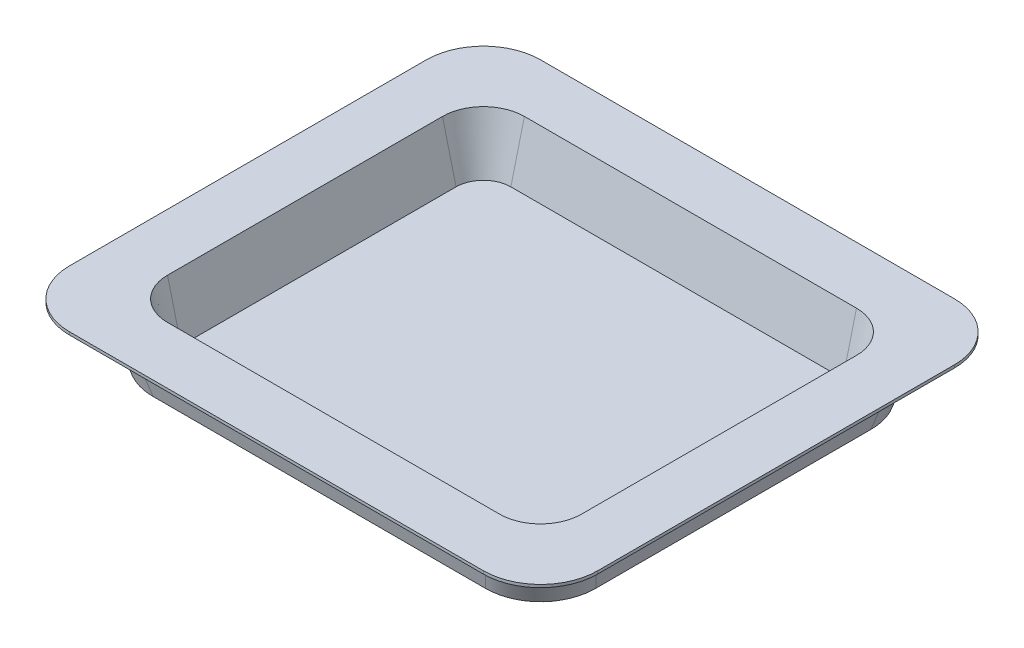
ISO-10303-21;
HEADER;
FILE_DESCRIPTION(('STEP AP214'),'2;1');
FILE_NAME('part.step','',(''),(''),'','','');
FILE_SCHEMA(('AUTOMOTIVE_DESIGN { 1 0 10303 214 1 1 1 1 }'));
ENDSEC;
DATA;
#1=APPLICATION_CONTEXT('core data for automotive mechanical design processes');
#2=APPLICATION_PROTOCOL_DEFINITION('international standard','automotive_design',2000,#1);
#3=PRODUCT_CONTEXT('',#1,'mechanical');
#4=PRODUCT('Part','Part','',(#3));
#5=PRODUCT_RELATED_PRODUCT_CATEGORY('part','',(#4));
#6=PRODUCT_DEFINITION_FORMATION('','',#4);
#7=PRODUCT_DEFINITION_CONTEXT('part definition',#1,'design');
#8=PRODUCT_DEFINITION('design','',#6,#7);
#9=PRODUCT_DEFINITION_SHAPE('','',#8);
#10=(LENGTH_UNIT() NAMED_UNIT(*) SI_UNIT(.MILLI.,.METRE.));
#11=(NAMED_UNIT(*) PLANE_ANGLE_UNIT() SI_UNIT($,.RADIAN.));
#12=(NAMED_UNIT(*) SI_UNIT($,.STERADIAN.) SOLID_ANGLE_UNIT());
#13=UNCERTAINTY_MEASURE_WITH_UNIT(LENGTH_MEASURE(1.E-05),#10,'distance_accuracy_value','');
#14=(GEOMETRIC_REPRESENTATION_CONTEXT(3) GLOBAL_UNCERTAINTY_ASSIGNED_CONTEXT((#13)) GLOBAL_UNIT_ASSIGNED_CONTEXT((#10,
#11,#12)) REPRESENTATION_CONTEXT('',''));
#15=CARTESIAN_POINT('',(0.,0.,0.));
#16=DIRECTION('',(0.,0.,1.));
#17=DIRECTION('',(1.,0.,0.));
#18=AXIS2_PLACEMENT_3D('',#15,#16,#17);
#19=CARTESIAN_POINT('',(326.248227946916,1.14491749414469E-12,0.));
#20=DIRECTION('',(0.,1.,0.));
#21=DIRECTION('',(0.,0.,-1.));
#22=AXIS2_PLACEMENT_3D('',#19,#20,#21);
#23=PLANE('',#22);
#24=CARTESIAN_POINT('',(-21.025886026542,-1.27675647831893E-12,-12.0952380952381));
#25=DIRECTION('',(0.,1.,0.));
#26=DIRECTION('',(0.,0.,-1.));
#27=AXIS2_PLACEMENT_3D('',#24,#25,#26);
#28=CIRCLE('',#27,50.8);
#29=CARTESIAN_POINT('',(-21.025886026542,-1.27675647831893E-12,38.7047619047619));
#30=VERTEX_POINT('',#29);
#31=CARTESIAN_POINT('',(-71.825886026542,-1.63757896132211E-12,-12.0952380952382));
#32=VERTEX_POINT('',#31);
#33=EDGE_CURVE('E63',#30,#32,#28,.F.);
#34=ORIENTED_EDGE('',*,*,#33,.F.);
#35=DIRECTION('',(-1.,0.,0.));
#36=VECTOR('',#35,1.);
#37=CARTESIAN_POINT('',(-71.825886026542,-1.63757896132211E-12,38.7047619047619));
#38=LINE('',#37,#36);
#39=CARTESIAN_POINT('',(347.274113973458,1.29063426612674E-12,38.7047619047619));
#40=VERTEX_POINT('',#39);
#41=EDGE_CURVE('E326',#40,#30,#38,.T.);
#42=ORIENTED_EDGE('',*,*,#41,.F.);
#43=CARTESIAN_POINT('',(347.274113973458,1.29063426612674E-12,-12.0952380952381));
#44=DIRECTION('',(0.,1.,0.));
#45=DIRECTION('',(0.,0.,-1.));
#46=AXIS2_PLACEMENT_3D('',#43,#44,#45);
#47=CIRCLE('',#46,50.8);
#48=CARTESIAN_POINT('',(398.074113973458,1.64451785522601E-12,-12.0952380952381));
#49=VERTEX_POINT('',#48);
#50=EDGE_CURVE('E289',#49,#40,#47,.F.);
#51=ORIENTED_EDGE('',*,*,#50,.F.);
#52=DIRECTION('',(0.,0.,1.));
#53=VECTOR('',#52,1.);
#54=CARTESIAN_POINT('',(398.074113973458,1.64451785522601E-12,-380.395238095238));
#55=LINE('',#54,#53);
#56=CARTESIAN_POINT('',(398.074113973458,1.64451785522601E-12,-329.595238095238));
#57=VERTEX_POINT('',#56);
#58=EDGE_CURVE('E324',#57,#49,#55,.T.);
#59=ORIENTED_EDGE('',*,*,#58,.F.);
#60=CARTESIAN_POINT('',(347.274113973458,1.29063426612674E-12,-329.595238095238));
#61=DIRECTION('',(0.,1.,0.));
#62=DIRECTION('',(0.,0.,-1.));
#63=AXIS2_PLACEMENT_3D('',#60,#61,#62);
#64=CIRCLE('',#63,50.8);
#65=CARTESIAN_POINT('',(347.274113973458,1.29063426612674E-12,-380.395238095238));
#66=VERTEX_POINT('',#65);
#67=EDGE_CURVE('E282',#66,#57,#64,.F.);
#68=ORIENTED_EDGE('',*,*,#67,.F.);
#69=DIRECTION('',(1.,0.,0.));
#70=VECTOR('',#69,1.);
#71=CARTESIAN_POINT('',(398.074113973458,1.64451785522601E-12,-380.395238095238));
#72=LINE('',#71,#70);
#73=CARTESIAN_POINT('',(-21.025886026542,-1.27675647831893E-12,-380.395238095238));
#74=VERTEX_POINT('',#73);
#75=EDGE_CURVE('E322',#74,#66,#72,.T.);
#76=ORIENTED_EDGE('',*,*,#75,.F.);
#77=CARTESIAN_POINT('',(-21.025886026542,-1.27675647831893E-12,-329.595238095238));
#78=DIRECTION('',(0.,1.,0.));
#79=DIRECTION('',(0.,0.,-1.));
#80=AXIS2_PLACEMENT_3D('',#77,#78,#79);
#81=CIRCLE('',#80,50.8);
#82=CARTESIAN_POINT('',(-71.825886026542,-1.63757896132211E-12,-329.595238095238));
#83=VERTEX_POINT('',#82);
#84=EDGE_CURVE('E276',#83,#74,#81,.F.);
#85=ORIENTED_EDGE('',*,*,#84,.F.);
#86=DIRECTION('',(0.,0.,-1.));
#87=VECTOR('',#86,1.);
#88=CARTESIAN_POINT('',(-71.825886026542,-1.63757896132211E-12,-380.395238095238));
#89=LINE('',#88,#87);
#90=EDGE_CURVE('E329',#32,#83,#89,.T.);
#91=ORIENTED_EDGE('',*,*,#90,.F.);
#92=EDGE_LOOP('',(#34,#42,#51,#59,#68,#76,#85,#91));
#93=FACE_BOUND('',#92,.T.);
#94=DIRECTION('',(0.,0.,1.));
#95=VECTOR('',#94,1.);
#96=CARTESIAN_POINT('',(347.274113973458,1.29063426612674E-12,-293.167851602296));
#97=LINE('',#96,#95);
#98=CARTESIAN_POINT('',(347.274113973458,1.29063426612674E-12,-293.167851602296));
#99=VERTEX_POINT('',#98);
#100=CARTESIAN_POINT('',(347.274113973458,1.29063426612674E-12,-48.5226245881807));
#101=VERTEX_POINT('',#100);
#102=EDGE_CURVE('E221',#99,#101,#97,.T.);
#103=ORIENTED_EDGE('',*,*,#102,.T.);
#104=CARTESIAN_POINT('',(310.846727480515,1.04083408558608E-12,-48.5226245881806));
#105=DIRECTION('',(0.,-1.,0.));
#106=DIRECTION('',(0.,0.,-1.));
#107=AXIS2_PLACEMENT_3D('',#104,#105,#106);
#108=CIRCLE('',#107,36.4273864929425);
#109=CARTESIAN_POINT('',(310.846727480515,1.04083408558608E-12,-12.0952380952382));
#110=VERTEX_POINT('',#109);
#111=EDGE_CURVE('E55',#101,#110,#108,.T.);
#112=ORIENTED_EDGE('',*,*,#111,.T.);
#113=DIRECTION('',(-1.,0.,0.));
#114=VECTOR('',#113,1.);
#115=CARTESIAN_POINT('',(15.4015004664004,-1.02695629777827E-12,-12.0952380952382));
#116=LINE('',#115,#114);
#117=CARTESIAN_POINT('',(15.4015004664004,-1.02695629777827E-12,-12.0952380952382));
#118=VERTEX_POINT('',#117);
#119=EDGE_CURVE('E202',#110,#118,#116,.T.);
#120=ORIENTED_EDGE('',*,*,#119,.T.);
#121=CARTESIAN_POINT('',(15.4015004664004,-1.02695629777827E-12,-48.5226245881807));
#122=DIRECTION('',(0.,-1.,0.));
#123=DIRECTION('',(0.,0.,1.));
#124=AXIS2_PLACEMENT_3D('',#121,#122,#123);
#125=CIRCLE('',#124,36.4273864929425);
#126=CARTESIAN_POINT('',(-21.0258860265421,-1.27675647831893E-12,-48.5226245881806));
#127=VERTEX_POINT('',#126);
#128=EDGE_CURVE('E210',#118,#127,#125,.T.);
#129=ORIENTED_EDGE('',*,*,#128,.T.);
#130=DIRECTION('',(0.,0.,-1.));
#131=VECTOR('',#130,1.);
#132=CARTESIAN_POINT('',(-21.0258860265421,-1.27675647831893E-12,-293.167851602296));
#133=LINE('',#132,#131);
#134=CARTESIAN_POINT('',(-21.0258860265421,-1.27675647831893E-12,-293.167851602296));
#135=VERTEX_POINT('',#134);
#136=EDGE_CURVE('E225',#127,#135,#133,.T.);
#137=ORIENTED_EDGE('',*,*,#136,.T.);
#138=CARTESIAN_POINT('',(15.4015004664004,-1.02695629777827E-12,-293.167851602296));
#139=DIRECTION('',(0.,-1.,0.));
#140=DIRECTION('',(0.,0.,-1.));
#141=AXIS2_PLACEMENT_3D('',#138,#139,#140);
#142=CIRCLE('',#141,36.4273864929425);
#143=CARTESIAN_POINT('',(15.4015004664004,-1.02695629777827E-12,-329.595238095238));
#144=VERTEX_POINT('',#143);
#145=EDGE_CURVE('E228',#135,#144,#142,.T.);
#146=ORIENTED_EDGE('',*,*,#145,.T.);
#147=DIRECTION('',(1.,0.,0.));
#148=VECTOR('',#147,1.);
#149=CARTESIAN_POINT('',(310.846727480515,1.04083408558608E-12,-329.595238095238));
#150=LINE('',#149,#148);
#151=CARTESIAN_POINT('',(310.846727480515,1.04083408558608E-12,-329.595238095238));
#152=VERTEX_POINT('',#151);
#153=EDGE_CURVE('E231',#144,#152,#150,.T.);
#154=ORIENTED_EDGE('',*,*,#153,.T.);
#155=CARTESIAN_POINT('',(310.846727480515,1.04083408558608E-12,-293.167851602296));
#156=DIRECTION('',(0.,-1.,0.));
#157=DIRECTION('',(0.,0.,1.));
#158=AXIS2_PLACEMENT_3D('',#155,#156,#157);
#159=CIRCLE('',#158,36.4273864929425);
#160=EDGE_CURVE('E234',#152,#99,#159,.T.);
#161=ORIENTED_EDGE('',*,*,#160,.T.);
#162=EDGE_LOOP('',(#103,#112,#120,#129,#137,#146,#154,#161));
#163=FACE_BOUND('',#162,.T.);
#164=ADVANCED_FACE('F40',(#93,#163),#23,.T.);
#165=CARTESIAN_POINT('',(326.248227946916,-2.53999999999886,0.));
#166=DIRECTION('',(0.,-1.,0.));
#167=DIRECTION('',(0.,0.,1.));
#168=AXIS2_PLACEMENT_3D('',#165,#166,#167);
#169=PLANE('',#168);
#170=DIRECTION('',(0.,0.,-1.));
#171=VECTOR('',#170,1.);
#172=CARTESIAN_POINT('',(372.674113973458,-2.53999999999853,-354.995238095238));
#173=LINE('',#172,#171);
#174=CARTESIAN_POINT('',(372.674113973458,-2.53999999999853,-35.8226245881806));
#175=VERTEX_POINT('',#174);
#176=CARTESIAN_POINT('',(372.674113973458,-2.53999999999853,-305.867851602296));
#177=VERTEX_POINT('',#176);
#178=EDGE_CURVE('E312',#175,#177,#173,.T.);
#179=ORIENTED_EDGE('',*,*,#178,.T.);
#180=CARTESIAN_POINT('',(320.144553900672,-2.53999999999888,-302.465678022452));
#181=DIRECTION('',(0.,-1.,0.));
#182=DIRECTION('',(0.707106781186548,0.,-0.707106781186547));
#183=AXIS2_PLACEMENT_3D('',#180,#181,#182);
#184=ELLIPSE('',#183,54.203960767465,50.8);
#185=CARTESIAN_POINT('',(323.546727480515,-2.53999999999888,-354.995238095238));
#186=VERTEX_POINT('',#185);
#187=EDGE_CURVE('E347',#177,#186,#184,.F.);
#188=ORIENTED_EDGE('',*,*,#187,.T.);
#189=DIRECTION('',(-1.,0.,0.));
#190=VECTOR('',#189,1.);
#191=CARTESIAN_POINT('',(372.674113973458,-2.53999999999853,-354.995238095238));
#192=LINE('',#191,#190);
#193=CARTESIAN_POINT('',(2.70150046640039,-2.54000000000112,-354.995238095238));
#194=VERTEX_POINT('',#193);
#195=EDGE_CURVE('E307',#186,#194,#192,.T.);
#196=ORIENTED_EDGE('',*,*,#195,.T.);
#197=CARTESIAN_POINT('',(6.10367404624407,-2.54000000000109,-302.465678022452));
#198=DIRECTION('',(0.,-1.,0.));
#199=DIRECTION('',(0.707106781186548,0.,0.707106781186547));
#200=AXIS2_PLACEMENT_3D('',#197,#198,#199);
#201=ELLIPSE('',#200,54.203960767465,50.8);
#202=CARTESIAN_POINT('',(-46.425886026542,-2.54000000000146,-305.867851602296));
#203=VERTEX_POINT('',#202);
#204=EDGE_CURVE('E356',#194,#203,#201,.F.);
#205=ORIENTED_EDGE('',*,*,#204,.T.);
#206=DIRECTION('',(0.,0.,1.));
#207=VECTOR('',#206,1.);
#208=CARTESIAN_POINT('',(-46.425886026542,-2.54000000000146,-354.995238095238));
#209=LINE('',#208,#207);
#210=CARTESIAN_POINT('',(-46.4258860265421,-2.54000000000146,-35.8226245881806));
#211=VERTEX_POINT('',#210);
#212=EDGE_CURVE('E304',#203,#211,#209,.T.);
#213=ORIENTED_EDGE('',*,*,#212,.T.);
#214=CARTESIAN_POINT('',(6.10367404624412,-2.54000000000109,-39.2247981680243));
#215=DIRECTION('',(0.,-1.,0.));
#216=DIRECTION('',(-0.707106781186546,0.,0.707106781186549));
#217=AXIS2_PLACEMENT_3D('',#214,#215,#216);
#218=ELLIPSE('',#217,54.203960767465,50.8);
#219=CARTESIAN_POINT('',(2.70150046640044,-2.54000000000112,13.3047619047618));
#220=VERTEX_POINT('',#219);
#221=EDGE_CURVE('E365',#211,#220,#218,.F.);
#222=ORIENTED_EDGE('',*,*,#221,.T.);
#223=DIRECTION('',(-1.,0.,0.));
#224=VECTOR('',#223,1.);
#225=CARTESIAN_POINT('',(326.248227946916,-2.53999999999886,13.3047619047619));
#226=LINE('',#225,#224);
#227=CARTESIAN_POINT('',(323.546727480516,-2.53999999999888,13.3047619047619));
#228=VERTEX_POINT('',#227);
#229=EDGE_CURVE('E317',#228,#220,#226,.T.);
#230=ORIENTED_EDGE('',*,*,#229,.F.);
#231=CARTESIAN_POINT('',(320.144553900672,-2.5399999999989,-39.2247981680243));
#232=DIRECTION('',(0.,-1.,0.));
#233=DIRECTION('',(-0.707106781186547,0.,-0.707106781186548));
#234=AXIS2_PLACEMENT_3D('',#231,#232,#233);
#235=ELLIPSE('',#234,54.203960767465,50.8);
#236=EDGE_CURVE('E338',#228,#175,#235,.F.);
#237=ORIENTED_EDGE('',*,*,#236,.T.);
#238=EDGE_LOOP('',(#179,#188,#196,#205,#213,#222,#230,#237));
#239=FACE_BOUND('',#238,.T.);
#240=CARTESIAN_POINT('',(-21.025886026542,-2.54000000000128,-12.0952380952381));
#241=DIRECTION('',(0.,-1.,0.));
#242=DIRECTION('',(0.,0.,1.));
#243=AXIS2_PLACEMENT_3D('',#240,#241,#242);
#244=CIRCLE('',#243,50.8);
#245=CARTESIAN_POINT('',(-71.825886026542,-2.54000000000164,-12.0952380952381));
#246=VERTEX_POINT('',#245);
#247=CARTESIAN_POINT('',(-21.025886026542,-2.54000000000128,38.7047619047619));
#248=VERTEX_POINT('',#247);
#249=EDGE_CURVE('E267',#246,#248,#244,.F.);
#250=ORIENTED_EDGE('',*,*,#249,.F.);
#251=DIRECTION('',(0.,0.,-1.));
#252=VECTOR('',#251,1.);
#253=CARTESIAN_POINT('',(-71.825886026542,-2.54000000000164,38.7047619047619));
#254=LINE('',#253,#252);
#255=CARTESIAN_POINT('',(-71.825886026542,-2.54000000000164,-329.595238095238));
#256=VERTEX_POINT('',#255);
#257=EDGE_CURVE('E302',#246,#256,#254,.T.);
#258=ORIENTED_EDGE('',*,*,#257,.T.);
#259=CARTESIAN_POINT('',(-21.025886026542,-2.54000000000128,-329.595238095238));
#260=DIRECTION('',(0.,-1.,0.));
#261=DIRECTION('',(0.,0.,1.));
#262=AXIS2_PLACEMENT_3D('',#259,#260,#261);
#263=CIRCLE('',#262,50.8);
#264=CARTESIAN_POINT('',(-21.025886026542,-2.54000000000128,-380.395238095238));
#265=VERTEX_POINT('',#264);
#266=EDGE_CURVE('E273',#265,#256,#263,.F.);
#267=ORIENTED_EDGE('',*,*,#266,.F.);
#268=DIRECTION('',(1.,0.,0.));
#269=VECTOR('',#268,1.);
#270=CARTESIAN_POINT('',(398.074113973458,-2.53999999999836,-380.395238095238));
#271=LINE('',#270,#269);
#272=CARTESIAN_POINT('',(347.274113973458,-2.53999999999871,-380.395238095238));
#273=VERTEX_POINT('',#272);
#274=EDGE_CURVE('E310',#265,#273,#271,.T.);
#275=ORIENTED_EDGE('',*,*,#274,.T.);
#276=CARTESIAN_POINT('',(347.274113973458,-2.53999999999871,-329.595238095238));
#277=DIRECTION('',(0.,-1.,0.));
#278=DIRECTION('',(0.,0.,1.));
#279=AXIS2_PLACEMENT_3D('',#276,#277,#278);
#280=CIRCLE('',#279,50.8);
#281=CARTESIAN_POINT('',(398.074113973458,-2.53999999999836,-329.595238095238));
#282=VERTEX_POINT('',#281);
#283=EDGE_CURVE('E370',#282,#273,#280,.F.);
#284=ORIENTED_EDGE('',*,*,#283,.F.);
#285=DIRECTION('',(0.,0.,1.));
#286=VECTOR('',#285,1.);
#287=CARTESIAN_POINT('',(398.074113973458,-2.53999999999836,-380.395238095238));
#288=LINE('',#287,#286);
#289=CARTESIAN_POINT('',(398.074113973458,-2.53999999999836,-12.0952380952381));
#290=VERTEX_POINT('',#289);
#291=EDGE_CURVE('E315',#282,#290,#288,.T.);
#292=ORIENTED_EDGE('',*,*,#291,.T.);
#293=CARTESIAN_POINT('',(347.274113973458,-2.53999999999871,-12.0952380952381));
#294=DIRECTION('',(0.,-1.,0.));
#295=DIRECTION('',(0.,0.,1.));
#296=AXIS2_PLACEMENT_3D('',#293,#294,#295);
#297=CIRCLE('',#296,50.8);
#298=CARTESIAN_POINT('',(347.274113973458,-2.53999999999871,38.7047619047619));
#299=VERTEX_POINT('',#298);
#300=EDGE_CURVE('E367',#299,#290,#297,.F.);
#301=ORIENTED_EDGE('',*,*,#300,.F.);
#302=DIRECTION('',(1.,0.,0.));
#303=VECTOR('',#302,1.);
#304=CARTESIAN_POINT('',(326.248227946916,-2.53999999999886,38.7047619047619));
#305=LINE('',#304,#303);
#306=EDGE_CURVE('E320',#248,#299,#305,.T.);
#307=ORIENTED_EDGE('',*,*,#306,.F.);
#308=EDGE_LOOP('',(#250,#258,#267,#275,#284,#292,#301,#307));
#309=FACE_BOUND('',#308,.T.);
#310=ADVANCED_FACE('F397',(#239,#309),#169,.T.);
#311=CARTESIAN_POINT('',(-71.825886026542,-1.63757896132211E-12,-380.395238095238));
#312=DIRECTION('',(-1.,0.,0.));
#313=DIRECTION('',(0.,0.,-1.));
#314=AXIS2_PLACEMENT_3D('',#311,#312,#313);
#315=PLANE('',#314);
#316=ORIENTED_EDGE('',*,*,#257,.F.);
#317=DIRECTION('',(0.,-1.,0.));
#318=VECTOR('',#317,1.);
#319=CARTESIAN_POINT('',(-71.8258860265424,62.2299999999984,-12.0952380952381));
#320=LINE('',#319,#318);
#321=EDGE_CURVE('E11',#246,#32,#320,.F.);
#322=ORIENTED_EDGE('',*,*,#321,.T.);
#323=ORIENTED_EDGE('',*,*,#90,.T.);
#324=DIRECTION('',(0.,-1.,0.));
#325=VECTOR('',#324,1.);
#326=CARTESIAN_POINT('',(-71.8258860265424,62.2299999999984,-329.595238095238));
#327=LINE('',#326,#325);
#328=EDGE_CURVE('E270',#83,#256,#327,.T.);
#329=ORIENTED_EDGE('',*,*,#328,.T.);
#330=EDGE_LOOP('',(#316,#322,#323,#329));
#331=FACE_BOUND('',#330,.T.);
#332=ADVANCED_FACE('F408',(#331),#315,.T.);
#333=CARTESIAN_POINT('',(398.074113973458,1.64451785522601E-12,-380.395238095238));
#334=DIRECTION('',(0.,0.,-1.));
#335=DIRECTION('',(1.,0.,0.));
#336=AXIS2_PLACEMENT_3D('',#333,#334,#335);
#337=PLANE('',#336);
#338=ORIENTED_EDGE('',*,*,#274,.F.);
#339=DIRECTION('',(0.,-1.,0.));
#340=VECTOR('',#339,1.);
#341=CARTESIAN_POINT('',(-21.0258860265425,62.2299999999987,-380.395238095238));
#342=LINE('',#341,#340);
#343=EDGE_CURVE('E48',#265,#74,#342,.F.);
#344=ORIENTED_EDGE('',*,*,#343,.T.);
#345=ORIENTED_EDGE('',*,*,#75,.T.);
#346=DIRECTION('',(0.,-1.,0.));
#347=VECTOR('',#346,1.);
#348=CARTESIAN_POINT('',(347.274113973458,62.2300000000013,-380.395238095238));
#349=LINE('',#348,#347);
#350=EDGE_CURVE('E279',#66,#273,#349,.T.);
#351=ORIENTED_EDGE('',*,*,#350,.T.);
#352=EDGE_LOOP('',(#338,#344,#345,#351));
#353=FACE_BOUND('',#352,.T.);
#354=ADVANCED_FACE('F376',(#353),#337,.T.);
#355=CARTESIAN_POINT('',(398.074113973458,1.64451785522601E-12,-380.395238095238));
#356=DIRECTION('',(1.,0.,0.));
#357=DIRECTION('',(0.,0.,1.));
#358=AXIS2_PLACEMENT_3D('',#355,#356,#357);
#359=PLANE('',#358);
#360=ORIENTED_EDGE('',*,*,#291,.F.);
#361=DIRECTION('',(0.,-1.,0.));
#362=VECTOR('',#361,1.);
#363=CARTESIAN_POINT('',(398.074113973458,62.2300000000016,-329.595238095238));
#364=LINE('',#363,#362);
#365=EDGE_CURVE('E278',#57,#282,#364,.T.);
#366=ORIENTED_EDGE('',*,*,#365,.F.);
#367=ORIENTED_EDGE('',*,*,#58,.T.);
#368=DIRECTION('',(0.,-1.,0.));
#369=VECTOR('',#368,1.);
#370=CARTESIAN_POINT('',(398.074113973457,62.2300000000016,-12.0952380952381));
#371=LINE('',#370,#369);
#372=EDGE_CURVE('E286',#49,#290,#371,.T.);
#373=ORIENTED_EDGE('',*,*,#372,.T.);
#374=EDGE_LOOP('',(#360,#366,#367,#373));
#375=FACE_BOUND('',#374,.T.);
#376=ADVANCED_FACE('F392',(#375),#359,.T.);
#377=CARTESIAN_POINT('',(-71.825886026542,-1.63757896132211E-12,38.7047619047619));
#378=DIRECTION('',(0.,0.,1.));
#379=DIRECTION('',(-1.,0.,0.));
#380=AXIS2_PLACEMENT_3D('',#377,#378,#379);
#381=PLANE('',#380);
#382=DIRECTION('',(0.,-1.,0.));
#383=VECTOR('',#382,1.);
#384=CARTESIAN_POINT('',(-21.0258860265424,62.2299999999987,38.7047619047619));
#385=LINE('',#384,#383);
#386=EDGE_CURVE('E216',#30,#248,#385,.T.);
#387=ORIENTED_EDGE('',*,*,#386,.T.);
#388=ORIENTED_EDGE('',*,*,#306,.T.);
#389=DIRECTION('',(0.,-1.,0.));
#390=VECTOR('',#389,1.);
#391=CARTESIAN_POINT('',(347.274113973458,62.2300000000013,38.7047619047619));
#392=LINE('',#391,#390);
#393=EDGE_CURVE('E285',#40,#299,#392,.T.);
#394=ORIENTED_EDGE('',*,*,#393,.F.);
#395=ORIENTED_EDGE('',*,*,#41,.T.);
#396=EDGE_LOOP('',(#387,#388,#394,#395));
#397=FACE_BOUND('',#396,.T.);
#398=ADVANCED_FACE('F404',(#397),#381,.T.);
#399=CARTESIAN_POINT('',(326.248227946916,-50.7999999999989,0.));
#400=DIRECTION('',(0.,1.,0.));
#401=DIRECTION('',(0.,0.,-1.));
#402=AXIS2_PLACEMENT_3D('',#399,#400,#401);
#403=PLANE('',#402);
#404=DIRECTION('',(-1.,0.,0.));
#405=VECTOR('',#404,1.);
#406=CARTESIAN_POINT('',(480.680227946916,-50.7999999999978,0.604761904761816));
#407=LINE('',#406,#405);
#408=CARTESIAN_POINT('',(310.846727480516,-50.799999999999,0.604761904761816));
#409=VERTEX_POINT('',#408);
#410=CARTESIAN_POINT('',(15.4015004664008,-50.800000000001,0.604761904761816));
#411=VERTEX_POINT('',#410);
#412=EDGE_CURVE('E295',#409,#411,#407,.T.);
#413=ORIENTED_EDGE('',*,*,#412,.T.);
#414=CARTESIAN_POINT('',(18.8036740462444,-50.800000000001,-51.9247981680243));
#415=DIRECTION('',(0.,1.,0.));
#416=DIRECTION('',(-0.707106781186546,0.,0.707106781186549));
#417=AXIS2_PLACEMENT_3D('',#414,#415,#416);
#418=ELLIPSE('',#417,54.203960767465,50.8);
#419=CARTESIAN_POINT('',(-33.7258860265418,-50.8000000000014,-48.5226245881806));
#420=VERTEX_POINT('',#419);
#421=EDGE_CURVE('E361',#411,#420,#418,.F.);
#422=ORIENTED_EDGE('',*,*,#421,.T.);
#423=DIRECTION('',(0.,0.,-1.));
#424=VECTOR('',#423,1.);
#425=CARTESIAN_POINT('',(-33.7258860265418,-50.8000000000014,104.902));
#426=LINE('',#425,#424);
#427=CARTESIAN_POINT('',(-33.7258860265418,-50.8000000000014,-293.167851602296));
#428=VERTEX_POINT('',#427);
#429=EDGE_CURVE('E298',#420,#428,#426,.T.);
#430=ORIENTED_EDGE('',*,*,#429,.T.);
#431=CARTESIAN_POINT('',(18.8036740462443,-50.800000000001,-289.765678022452));
#432=DIRECTION('',(0.,1.,0.));
#433=DIRECTION('',(0.707106781186548,0.,0.707106781186547));
#434=AXIS2_PLACEMENT_3D('',#431,#432,#433);
#435=ELLIPSE('',#434,54.203960767465,50.8);
#436=CARTESIAN_POINT('',(15.4015004664007,-50.800000000001,-342.295238095238));
#437=VERTEX_POINT('',#436);
#438=EDGE_CURVE('E352',#428,#437,#435,.F.);
#439=ORIENTED_EDGE('',*,*,#438,.T.);
#440=DIRECTION('',(1.,0.,0.));
#441=VECTOR('',#440,1.);
#442=CARTESIAN_POINT('',(-93.3597720530837,-50.8000000000018,-342.295238095238));
#443=LINE('',#442,#441);
#444=CARTESIAN_POINT('',(310.846727480516,-50.799999999999,-342.295238095238));
#445=VERTEX_POINT('',#444);
#446=EDGE_CURVE('E293',#437,#445,#443,.T.);
#447=ORIENTED_EDGE('',*,*,#446,.T.);
#448=CARTESIAN_POINT('',(307.444553900672,-50.799999999999,-289.765678022452));
#449=DIRECTION('',(0.,1.,0.));
#450=DIRECTION('',(0.707106781186548,0.,-0.707106781186547));
#451=AXIS2_PLACEMENT_3D('',#448,#449,#450);
#452=ELLIPSE('',#451,54.203960767465,50.8);
#453=CARTESIAN_POINT('',(359.974113973458,-50.7999999999986,-293.167851602296));
#454=VERTEX_POINT('',#453);
#455=EDGE_CURVE('E343',#445,#454,#452,.F.);
#456=ORIENTED_EDGE('',*,*,#455,.T.);
#457=DIRECTION('',(0.,0.,1.));
#458=VECTOR('',#457,1.);
#459=CARTESIAN_POINT('',(359.974113973458,-50.7999999999986,-416.052));
#460=LINE('',#459,#458);
#461=CARTESIAN_POINT('',(359.974113973458,-50.7999999999986,-48.5226245881807));
#462=VERTEX_POINT('',#461);
#463=EDGE_CURVE('E300',#454,#462,#460,.T.);
#464=ORIENTED_EDGE('',*,*,#463,.T.);
#465=CARTESIAN_POINT('',(307.444553900672,-50.799999999999,-51.9247981680243));
#466=DIRECTION('',(0.,1.,0.));
#467=DIRECTION('',(-0.707106781186547,0.,-0.707106781186548));
#468=AXIS2_PLACEMENT_3D('',#465,#466,#467);
#469=ELLIPSE('',#468,54.203960767465,50.8);
#470=EDGE_CURVE('E334',#462,#409,#469,.F.);
#471=ORIENTED_EDGE('',*,*,#470,.T.);
#472=EDGE_LOOP('',(#413,#422,#430,#439,#447,#456,#464,#471));
#473=FACE_BOUND('',#472,.T.);
#474=ADVANCED_FACE('F429',(#473),#403,.F.);
#475=CARTESIAN_POINT('',(372.674113973458,-2.53999999999853,-416.052));
#476=DIRECTION('',(-0.967074537262648,0.254493299279637,0.));
#477=DIRECTION('',(-0.254493299279637,-0.967074537262648,0.));
#478=AXIS2_PLACEMENT_3D('',#475,#476,#477);
#479=PLANE('',#478);
#480=ORIENTED_EDGE('',*,*,#463,.F.);
#481=DIRECTION('',(-0.246631811833489,-0.937200884967283,0.246631811833495));
#482=VECTOR('',#481,1.);
#483=CARTESIAN_POINT('',(375.662397823394,8.81547862975703,-308.856135452231));
#484=LINE('',#483,#482);
#485=EDGE_CURVE('E345',#454,#177,#484,.F.);
#486=ORIENTED_EDGE('',*,*,#485,.T.);
#487=ORIENTED_EDGE('',*,*,#178,.F.);
#488=DIRECTION('',(-0.246631811833489,-0.937200884967283,-0.246631811833496));
#489=VECTOR('',#488,1.);
#490=CARTESIAN_POINT('',(349.545806466657,-90.4275685258453,-58.9509320949824));
#491=LINE('',#490,#489);
#492=EDGE_CURVE('E331',#175,#462,#491,.T.);
#493=ORIENTED_EDGE('',*,*,#492,.T.);
#494=EDGE_LOOP('',(#480,#486,#487,#493));
#495=FACE_BOUND('',#494,.T.);
#496=ADVANCED_FACE('F432',(#495),#479,.F.);
#497=CARTESIAN_POINT('',(-33.7258860265418,-50.8000000000014,104.902));
#498=DIRECTION('',(-0.967074537262645,-0.25449329927965,0.));
#499=DIRECTION('',(0.25449329927965,-0.967074537262645,0.));
#500=AXIS2_PLACEMENT_3D('',#497,#498,#499);
#501=PLANE('',#500);
#502=ORIENTED_EDGE('',*,*,#429,.F.);
#503=DIRECTION('',(0.246631811833501,-0.937200884967279,-0.246631811833496));
#504=VECTOR('',#503,1.);
#505=CARTESIAN_POINT('',(-49.4141698764778,8.81547862975406,-32.8343407382449));
#506=LINE('',#505,#504);
#507=EDGE_CURVE('E363',#420,#211,#506,.F.);
#508=ORIENTED_EDGE('',*,*,#507,.T.);
#509=ORIENTED_EDGE('',*,*,#212,.F.);
#510=DIRECTION('',(0.246631811833501,-0.93720088496728,0.246631811833495));
#511=VECTOR('',#510,1.);
#512=CARTESIAN_POINT('',(-9.51239140353044,-142.811279567442,-268.954356979285));
#513=LINE('',#512,#511);
#514=EDGE_CURVE('E349',#203,#428,#513,.T.);
#515=ORIENTED_EDGE('',*,*,#514,.T.);
#516=EDGE_LOOP('',(#502,#508,#509,#515));
#517=FACE_BOUND('',#516,.T.);
#518=ADVANCED_FACE('F466',(#517),#501,.T.);
#519=CARTESIAN_POINT('',(480.680227946916,-50.7999999999978,0.604761904761816));
#520=DIRECTION('',(0.,0.254493299279644,-0.967074537262646));
#521=DIRECTION('',(0.,-0.967074537262646,-0.254493299279644));
#522=AXIS2_PLACEMENT_3D('',#519,#520,#521);
#523=PLANE('',#522);
#524=ORIENTED_EDGE('',*,*,#229,.T.);
#525=DIRECTION('',(0.246631811833501,-0.937200884967279,-0.246631811833496));
#526=VECTOR('',#525,1.);
#527=CARTESIAN_POINT('',(12.413216616465,-39.4445213702455,3.5930457546975));
#528=LINE('',#527,#526);
#529=EDGE_CURVE('E358',#220,#411,#528,.T.);
#530=ORIENTED_EDGE('',*,*,#529,.T.);
#531=ORIENTED_EDGE('',*,*,#412,.F.);
#532=DIRECTION('',(-0.246631811833489,-0.937200884967283,-0.246631811833496));
#533=VECTOR('',#532,1.);
#534=CARTESIAN_POINT('',(321.177232375066,-11.5440814007092,10.9352667993118));
#535=LINE('',#534,#533);
#536=EDGE_CURVE('E336',#409,#228,#535,.F.);
#537=ORIENTED_EDGE('',*,*,#536,.T.);
#538=EDGE_LOOP('',(#524,#530,#531,#537));
#539=FACE_BOUND('',#538,.T.);
#540=ADVANCED_FACE('F472',(#539),#523,.F.);
#541=CARTESIAN_POINT('',(-93.3597720530837,-50.8000000000018,-342.295238095238));
#542=DIRECTION('',(0.,-0.254493299279643,-0.967074537262646));
#543=DIRECTION('',(0.,-0.967074537262647,0.254493299279644));
#544=AXIS2_PLACEMENT_3D('',#541,#542,#543);
#545=PLANE('',#544);
#546=ORIENTED_EDGE('',*,*,#446,.F.);
#547=DIRECTION('',(0.246631811833501,-0.937200884967279,0.246631811833495));
#548=VECTOR('',#547,1.);
#549=CARTESIAN_POINT('',(8.78585128638326,-25.6605331159354,-348.910887275255));
#550=LINE('',#549,#548);
#551=EDGE_CURVE('E354',#437,#194,#550,.F.);
#552=ORIENTED_EDGE('',*,*,#551,.T.);
#553=ORIENTED_EDGE('',*,*,#195,.F.);
#554=DIRECTION('',(-0.246631811833489,-0.937200884967283,0.246631811833495));
#555=VECTOR('',#554,1.);
#556=CARTESIAN_POINT('',(313.835011330451,-39.4445213702433,-345.283521945174));
#557=LINE('',#556,#555);
#558=EDGE_CURVE('E340',#186,#445,#557,.T.);
#559=ORIENTED_EDGE('',*,*,#558,.T.);
#560=EDGE_LOOP('',(#546,#552,#553,#559));
#561=FACE_BOUND('',#560,.T.);
#562=ADVANCED_FACE('F446',(#561),#545,.T.);
#563=CARTESIAN_POINT('',(300.418419973714,-77.4993089224397,-58.9509320949824));
#564=DIRECTION('',(-0.246631811833488,-0.937200884967283,-0.246631811833496));
#565=DIRECTION('',(0.,-0.254493299279644,0.967074537262646));
#566=AXIS2_PLACEMENT_3D('',#563,#564,#565);
#567=CYLINDRICAL_SURFACE('',#566,50.8);
#568=ORIENTED_EDGE('',*,*,#236,.F.);
#569=ORIENTED_EDGE('',*,*,#536,.F.);
#570=ORIENTED_EDGE('',*,*,#470,.F.);
#571=ORIENTED_EDGE('',*,*,#492,.F.);
#572=EDGE_LOOP('',(#568,#569,#570,#571));
#573=FACE_BOUND('',#572,.T.);
#574=ADVANCED_FACE('F442',(#573),#567,.T.);
#575=CARTESIAN_POINT('',(286.259957435894,-131.30146656616,-268.581081557673));
#576=DIRECTION('',(0.246631811833489,0.937200884967283,-0.246631811833495));
#577=DIRECTION('',(-0.967074537262648,0.254493299279637,0.));
#578=AXIS2_PLACEMENT_3D('',#575,#576,#577);
#579=CYLINDRICAL_SURFACE('',#578,50.8);
#580=ORIENTED_EDGE('',*,*,#187,.F.);
#581=ORIENTED_EDGE('',*,*,#485,.F.);
#582=ORIENTED_EDGE('',*,*,#455,.F.);
#583=ORIENTED_EDGE('',*,*,#558,.F.);
#584=EDGE_LOOP('',(#580,#581,#582,#583));
#585=FACE_BOUND('',#584,.T.);
#586=ADVANCED_FACE('F445',(#585),#579,.T.);
#587=CARTESIAN_POINT('',(39.6149950894119,-129.883019964035,-268.954356979285));
#588=DIRECTION('',(0.246631811833501,-0.93720088496728,0.246631811833495));
#589=DIRECTION('',(0.967074537262645,0.25449329927965,0.));
#590=AXIS2_PLACEMENT_3D('',#587,#588,#589);
#591=CYLINDRICAL_SURFACE('',#590,50.8);
#592=ORIENTED_EDGE('',*,*,#204,.F.);
#593=ORIENTED_EDGE('',*,*,#551,.F.);
#594=ORIENTED_EDGE('',*,*,#438,.F.);
#595=ORIENTED_EDGE('',*,*,#514,.F.);
#596=EDGE_LOOP('',(#592,#593,#594,#595));
#597=FACE_BOUND('',#596,.T.);
#598=ADVANCED_FACE('F449',(#597),#591,.T.);
#599=CARTESIAN_POINT('',(43.7031262255568,-145.417918281385,-76.8242503473361));
#600=DIRECTION('',(-0.246631811833501,0.937200884967279,0.246631811833496));
#601=DIRECTION('',(0.,0.254493299279644,-0.967074537262646));
#602=AXIS2_PLACEMENT_3D('',#599,#600,#601);
#603=CYLINDRICAL_SURFACE('',#602,50.8);
#604=ORIENTED_EDGE('',*,*,#221,.F.);
#605=ORIENTED_EDGE('',*,*,#507,.F.);
#606=ORIENTED_EDGE('',*,*,#421,.F.);
#607=ORIENTED_EDGE('',*,*,#529,.F.);
#608=EDGE_LOOP('',(#604,#605,#606,#607));
#609=FACE_BOUND('',#608,.T.);
#610=ADVANCED_FACE('F42',(#609),#603,.T.);
#611=CARTESIAN_POINT('',(347.274113973457,62.2300000000013,-12.0952380952381));
#612=DIRECTION('',(0.,-1.,0.));
#613=DIRECTION('',(0.,0.,1.));
#614=AXIS2_PLACEMENT_3D('',#611,#612,#613);
#615=CYLINDRICAL_SURFACE('',#614,50.8);
#616=ORIENTED_EDGE('',*,*,#50,.T.);
#617=ORIENTED_EDGE('',*,*,#393,.T.);
#618=ORIENTED_EDGE('',*,*,#300,.T.);
#619=ORIENTED_EDGE('',*,*,#372,.F.);
#620=EDGE_LOOP('',(#616,#617,#618,#619));
#621=FACE_BOUND('',#620,.T.);
#622=ADVANCED_FACE('F400',(#621),#615,.T.);
#623=CARTESIAN_POINT('',(347.274113973458,62.2300000000013,-329.595238095238));
#624=DIRECTION('',(0.,-1.,0.));
#625=DIRECTION('',(0.,0.,1.));
#626=AXIS2_PLACEMENT_3D('',#623,#624,#625);
#627=CYLINDRICAL_SURFACE('',#626,50.8);
#628=ORIENTED_EDGE('',*,*,#67,.T.);
#629=ORIENTED_EDGE('',*,*,#365,.T.);
#630=ORIENTED_EDGE('',*,*,#283,.T.);
#631=ORIENTED_EDGE('',*,*,#350,.F.);
#632=EDGE_LOOP('',(#628,#629,#630,#631));
#633=FACE_BOUND('',#632,.T.);
#634=ADVANCED_FACE('F388',(#633),#627,.T.);
#635=CARTESIAN_POINT('',(-21.0258860265425,62.2299999999987,-329.595238095238));
#636=DIRECTION('',(0.,-1.,0.));
#637=DIRECTION('',(0.,0.,1.));
#638=AXIS2_PLACEMENT_3D('',#635,#636,#637);
#639=CYLINDRICAL_SURFACE('',#638,50.8);
#640=ORIENTED_EDGE('',*,*,#84,.T.);
#641=ORIENTED_EDGE('',*,*,#343,.F.);
#642=ORIENTED_EDGE('',*,*,#266,.T.);
#643=ORIENTED_EDGE('',*,*,#328,.F.);
#644=EDGE_LOOP('',(#640,#641,#642,#643));
#645=FACE_BOUND('',#644,.T.);
#646=ADVANCED_FACE('F409',(#645),#639,.T.);
#647=CARTESIAN_POINT('',(-21.0258860265424,62.2299999999987,-12.0952380952381));
#648=DIRECTION('',(0.,-1.,0.));
#649=DIRECTION('',(0.,0.,1.));
#650=AXIS2_PLACEMENT_3D('',#647,#648,#649);
#651=CYLINDRICAL_SURFACE('',#650,50.8);
#652=ORIENTED_EDGE('',*,*,#33,.T.);
#653=ORIENTED_EDGE('',*,*,#321,.F.);
#654=ORIENTED_EDGE('',*,*,#249,.T.);
#655=ORIENTED_EDGE('',*,*,#386,.F.);
#656=EDGE_LOOP('',(#652,#653,#654,#655));
#657=FACE_BOUND('',#656,.T.);
#658=ADVANCED_FACE('F410',(#657),#651,.T.);
#659=CARTESIAN_POINT('',(310.846727480515,1.04083408558608E-12,-48.5226245881806));
#660=DIRECTION('',(0.,1.,0.));
#661=DIRECTION('',(0.,0.,-1.));
#662=AXIS2_PLACEMENT_3D('',#659,#660,#661);
#663=CONICAL_SURFACE('',#662,36.4273864929425,0.244346095279206);
#664=ORIENTED_EDGE('',*,*,#111,.F.);
#665=DIRECTION('',(0.241921895599661,0.970295726275998,0.));
#666=VECTOR('',#665,1.);
#667=CARTESIAN_POINT('',(347.274113973458,1.29063426612674E-12,-48.5226245881807));
#668=LINE('',#667,#666);
#669=CARTESIAN_POINT('',(335.241544556246,-48.2599999999988,-48.5226245881807));
#670=VERTEX_POINT('',#669);
#671=EDGE_CURVE('E237',#670,#101,#668,.T.);
#672=ORIENTED_EDGE('',*,*,#671,.F.);
#673=CARTESIAN_POINT('',(310.846727480516,-48.259999999999,-48.5226245881806));
#674=DIRECTION('',(0.,1.,0.));
#675=DIRECTION('',(0.,0.,-1.));
#676=AXIS2_PLACEMENT_3D('',#673,#674,#675);
#677=CIRCLE('',#676,24.3948170757306);
#678=CARTESIAN_POINT('',(310.846727480516,-48.259999999999,-24.1278075124501));
#679=VERTEX_POINT('',#678);
#680=EDGE_CURVE('E215',#670,#679,#677,.F.);
#681=ORIENTED_EDGE('',*,*,#680,.T.);
#682=DIRECTION('',(0.,0.970295726275997,0.241921895599668));
#683=VECTOR('',#682,1.);
#684=CARTESIAN_POINT('',(310.846727480515,1.04083408558608E-12,-12.0952380952382));
#685=LINE('',#684,#683);
#686=EDGE_CURVE('E204',#679,#110,#685,.T.);
#687=ORIENTED_EDGE('',*,*,#686,.T.);
#688=EDGE_LOOP('',(#664,#672,#681,#687));
#689=FACE_BOUND('',#688,.T.);
#690=ADVANCED_FACE('F213',(#689),#663,.F.);
#691=CARTESIAN_POINT('',(15.4015004664004,-1.02695629777827E-12,-12.0952380952382));
#692=DIRECTION('',(0.,-0.241921895599668,0.970295726275996));
#693=DIRECTION('',(0.,0.970295726275996,0.241921895599668));
#694=AXIS2_PLACEMENT_3D('',#691,#692,#693);
#695=PLANE('',#694);
#696=ORIENTED_EDGE('',*,*,#119,.F.);
#697=ORIENTED_EDGE('',*,*,#686,.F.);
#698=DIRECTION('',(1.,0.,0.));
#699=VECTOR('',#698,1.);
#700=CARTESIAN_POINT('',(310.846727480516,-48.259999999999,-24.1278075124501));
#701=LINE('',#700,#699);
#702=CARTESIAN_POINT('',(15.4015004664007,-48.260000000001,-24.1278075124501));
#703=VERTEX_POINT('',#702);
#704=EDGE_CURVE('E252',#679,#703,#701,.F.);
#705=ORIENTED_EDGE('',*,*,#704,.T.);
#706=DIRECTION('',(0.,0.970295726275997,0.241921895599668));
#707=VECTOR('',#706,1.);
#708=CARTESIAN_POINT('',(15.4015004664004,-1.02695629777827E-12,-12.0952380952382));
#709=LINE('',#708,#707);
#710=EDGE_CURVE('E206',#703,#118,#709,.T.);
#711=ORIENTED_EDGE('',*,*,#710,.T.);
#712=EDGE_LOOP('',(#696,#697,#705,#711));
#713=FACE_BOUND('',#712,.T.);
#714=ADVANCED_FACE('F203',(#713),#695,.F.);
#715=CARTESIAN_POINT('',(15.4015004664004,-1.02695629777827E-12,-48.5226245881807));
#716=DIRECTION('',(0.,1.,0.));
#717=DIRECTION('',(0.,0.,1.));
#718=AXIS2_PLACEMENT_3D('',#715,#716,#717);
#719=CONICAL_SURFACE('',#718,36.4273864929425,0.244346095279206);
#720=ORIENTED_EDGE('',*,*,#128,.F.);
#721=ORIENTED_EDGE('',*,*,#710,.F.);
#722=CARTESIAN_POINT('',(15.4015004664007,-48.260000000001,-48.5226245881807));
#723=DIRECTION('',(0.,1.,0.));
#724=DIRECTION('',(0.,0.,-1.));
#725=AXIS2_PLACEMENT_3D('',#722,#723,#724);
#726=CIRCLE('',#725,24.3948170757306);
#727=CARTESIAN_POINT('',(-8.99331660932989,-48.2600000000012,-48.5226245881806));
#728=VERTEX_POINT('',#727);
#729=EDGE_CURVE('E254',#703,#728,#726,.F.);
#730=ORIENTED_EDGE('',*,*,#729,.T.);
#731=DIRECTION('',(-0.241921895599675,0.970295726275995,0.));
#732=VECTOR('',#731,1.);
#733=CARTESIAN_POINT('',(-21.0258860265421,-1.27675647831893E-12,-48.5226245881806));
#734=LINE('',#733,#732);
#735=EDGE_CURVE('E248',#728,#127,#734,.T.);
#736=ORIENTED_EDGE('',*,*,#735,.T.);
#737=EDGE_LOOP('',(#720,#721,#730,#736));
#738=FACE_BOUND('',#737,.T.);
#739=ADVANCED_FACE('F576',(#738),#719,.F.);
#740=CARTESIAN_POINT('',(-21.0258860265421,-1.27675647831893E-12,-293.167851602296));
#741=DIRECTION('',(-0.970295726275995,-0.241921895599675,0.));
#742=DIRECTION('',(0.241921895599675,-0.970295726275995,0.));
#743=AXIS2_PLACEMENT_3D('',#740,#741,#742);
#744=PLANE('',#743);
#745=ORIENTED_EDGE('',*,*,#136,.F.);
#746=ORIENTED_EDGE('',*,*,#735,.F.);
#747=DIRECTION('',(0.,0.,1.));
#748=VECTOR('',#747,1.);
#749=CARTESIAN_POINT('',(-8.99331660932989,-48.2600000000012,-48.5226245881807));
#750=LINE('',#749,#748);
#751=CARTESIAN_POINT('',(-8.99331660932989,-48.2600000000012,-293.167851602296));
#752=VERTEX_POINT('',#751);
#753=EDGE_CURVE('E256',#728,#752,#750,.F.);
#754=ORIENTED_EDGE('',*,*,#753,.T.);
#755=DIRECTION('',(-0.241921895599675,0.970295726275995,0.));
#756=VECTOR('',#755,1.);
#757=CARTESIAN_POINT('',(-21.0258860265421,-1.28369537222284E-12,-293.167851602296));
#758=LINE('',#757,#756);
#759=EDGE_CURVE('E246',#752,#135,#758,.T.);
#760=ORIENTED_EDGE('',*,*,#759,.T.);
#761=EDGE_LOOP('',(#745,#746,#754,#760));
#762=FACE_BOUND('',#761,.T.);
#763=ADVANCED_FACE('F584',(#762),#744,.F.);
#764=CARTESIAN_POINT('',(15.4015004664004,-1.02695629777827E-12,-293.167851602296));
#765=DIRECTION('',(0.,1.,0.));
#766=DIRECTION('',(0.,0.,-1.));
#767=AXIS2_PLACEMENT_3D('',#764,#765,#766);
#768=CONICAL_SURFACE('',#767,36.4273864929425,0.244346095279206);
#769=ORIENTED_EDGE('',*,*,#145,.F.);
#770=ORIENTED_EDGE('',*,*,#759,.F.);
#771=CARTESIAN_POINT('',(15.4015004664007,-48.260000000001,-293.167851602296));
#772=DIRECTION('',(0.,1.,0.));
#773=DIRECTION('',(0.,0.,-1.));
#774=AXIS2_PLACEMENT_3D('',#771,#772,#773);
#775=CIRCLE('',#774,24.3948170757306);
#776=CARTESIAN_POINT('',(15.4015004664007,-48.260000000001,-317.562668678026));
#777=VERTEX_POINT('',#776);
#778=EDGE_CURVE('E258',#752,#777,#775,.F.);
#779=ORIENTED_EDGE('',*,*,#778,.T.);
#780=DIRECTION('',(0.,0.970295726275997,-0.241921895599668));
#781=VECTOR('',#780,1.);
#782=CARTESIAN_POINT('',(15.4015004664004,-1.02695629777827E-12,-329.595238095238));
#783=LINE('',#782,#781);
#784=EDGE_CURVE('E244',#777,#144,#783,.T.);
#785=ORIENTED_EDGE('',*,*,#784,.T.);
#786=EDGE_LOOP('',(#769,#770,#779,#785));
#787=FACE_BOUND('',#786,.T.);
#788=ADVANCED_FACE('F594',(#787),#768,.F.);
#789=CARTESIAN_POINT('',(310.846727480515,1.04083408558608E-12,-329.595238095238));
#790=DIRECTION('',(0.,-0.241921895599668,-0.970295726275996));
#791=DIRECTION('',(0.,-0.970295726275996,0.241921895599668));
#792=AXIS2_PLACEMENT_3D('',#789,#790,#791);
#793=PLANE('',#792);
#794=ORIENTED_EDGE('',*,*,#153,.F.);
#795=ORIENTED_EDGE('',*,*,#784,.F.);
#796=DIRECTION('',(-1.,0.,0.));
#797=VECTOR('',#796,1.);
#798=CARTESIAN_POINT('',(310.846727480516,-48.259999999999,-317.562668678026));
#799=LINE('',#798,#797);
#800=CARTESIAN_POINT('',(310.846727480516,-48.259999999999,-317.562668678026));
#801=VERTEX_POINT('',#800);
#802=EDGE_CURVE('E260',#777,#801,#799,.F.);
#803=ORIENTED_EDGE('',*,*,#802,.T.);
#804=DIRECTION('',(0.,0.970295726275997,-0.241921895599668));
#805=VECTOR('',#804,1.);
#806=CARTESIAN_POINT('',(310.846727480515,1.04083408558608E-12,-329.595238095238));
#807=LINE('',#806,#805);
#808=EDGE_CURVE('E242',#801,#152,#807,.T.);
#809=ORIENTED_EDGE('',*,*,#808,.T.);
#810=EDGE_LOOP('',(#794,#795,#803,#809));
#811=FACE_BOUND('',#810,.T.);
#812=ADVANCED_FACE('F604',(#811),#793,.F.);
#813=CARTESIAN_POINT('',(310.846727480515,1.04083408558608E-12,-293.167851602296));
#814=DIRECTION('',(0.,1.,0.));
#815=DIRECTION('',(0.,0.,1.));
#816=AXIS2_PLACEMENT_3D('',#813,#814,#815);
#817=CONICAL_SURFACE('',#816,36.4273864929425,0.244346095279206);
#818=ORIENTED_EDGE('',*,*,#160,.F.);
#819=ORIENTED_EDGE('',*,*,#808,.F.);
#820=CARTESIAN_POINT('',(310.846727480516,-48.259999999999,-293.167851602296));
#821=DIRECTION('',(0.,1.,0.));
#822=DIRECTION('',(0.,0.,-1.));
#823=AXIS2_PLACEMENT_3D('',#820,#821,#822);
#824=CIRCLE('',#823,24.3948170757306);
#825=CARTESIAN_POINT('',(335.241544556246,-48.2599999999988,-293.167851602296));
#826=VERTEX_POINT('',#825);
#827=EDGE_CURVE('E262',#801,#826,#824,.F.);
#828=ORIENTED_EDGE('',*,*,#827,.T.);
#829=DIRECTION('',(0.241921895599661,0.970295726275998,0.));
#830=VECTOR('',#829,1.);
#831=CARTESIAN_POINT('',(347.274113973458,1.29063426612674E-12,-293.167851602296));
#832=LINE('',#831,#830);
#833=EDGE_CURVE('E239',#826,#99,#832,.T.);
#834=ORIENTED_EDGE('',*,*,#833,.T.);
#835=EDGE_LOOP('',(#818,#819,#828,#834));
#836=FACE_BOUND('',#835,.T.);
#837=ADVANCED_FACE('F614',(#836),#817,.F.);
#838=CARTESIAN_POINT('',(347.274113973458,1.29063426612674E-12,-293.167851602296));
#839=DIRECTION('',(0.970295726275998,-0.241921895599661,0.));
#840=DIRECTION('',(0.241921895599661,0.970295726275998,0.));
#841=AXIS2_PLACEMENT_3D('',#838,#839,#840);
#842=PLANE('',#841);
#843=ORIENTED_EDGE('',*,*,#102,.F.);
#844=ORIENTED_EDGE('',*,*,#833,.F.);
#845=DIRECTION('',(0.,0.,-1.));
#846=VECTOR('',#845,1.);
#847=CARTESIAN_POINT('',(335.241544556246,-48.2599999999988,-48.5226245881806));
#848=LINE('',#847,#846);
#849=EDGE_CURVE('E240',#826,#670,#848,.F.);
#850=ORIENTED_EDGE('',*,*,#849,.T.);
#851=ORIENTED_EDGE('',*,*,#671,.T.);
#852=EDGE_LOOP('',(#843,#844,#850,#851));
#853=FACE_BOUND('',#852,.T.);
#854=ADVANCED_FACE('F624',(#853),#842,.F.);
#855=CARTESIAN_POINT('',(310.846727480516,-48.259999999999,-48.5226245881806));
#856=DIRECTION('',(0.,1.,0.));
#857=DIRECTION('',(0.,0.,-1.));
#858=AXIS2_PLACEMENT_3D('',#855,#856,#857);
#859=PLANE('',#858);
#860=ORIENTED_EDGE('',*,*,#680,.F.);
#861=ORIENTED_EDGE('',*,*,#849,.F.);
#862=ORIENTED_EDGE('',*,*,#827,.F.);
#863=ORIENTED_EDGE('',*,*,#802,.F.);
#864=ORIENTED_EDGE('',*,*,#778,.F.);
#865=ORIENTED_EDGE('',*,*,#753,.F.);
#866=ORIENTED_EDGE('',*,*,#729,.F.);
#867=ORIENTED_EDGE('',*,*,#704,.F.);
#868=EDGE_LOOP('',(#860,#861,#862,#863,#864,#865,#866,#867));
#869=FACE_BOUND('',#868,.T.);
#870=ADVANCED_FACE('F634',(#869),#859,.T.);
#871=CLOSED_SHELL('',(#164,#310,#332,#354,#376,#398,#474,#496,#518,#540,#562,#574,#586,#598,
#610,#622,#634,#646,#658,#690,#714,#739,#763,#788,#812,#837,#854,#870));
#872=MANIFOLD_SOLID_BREP('B2',#871);
#873=ADVANCED_BREP_SHAPE_REPRESENTATION('',(#18,#872),#14);
#874=SHAPE_DEFINITION_REPRESENTATION(#9,#873);
ENDSEC;
END-ISO-10303-21;
